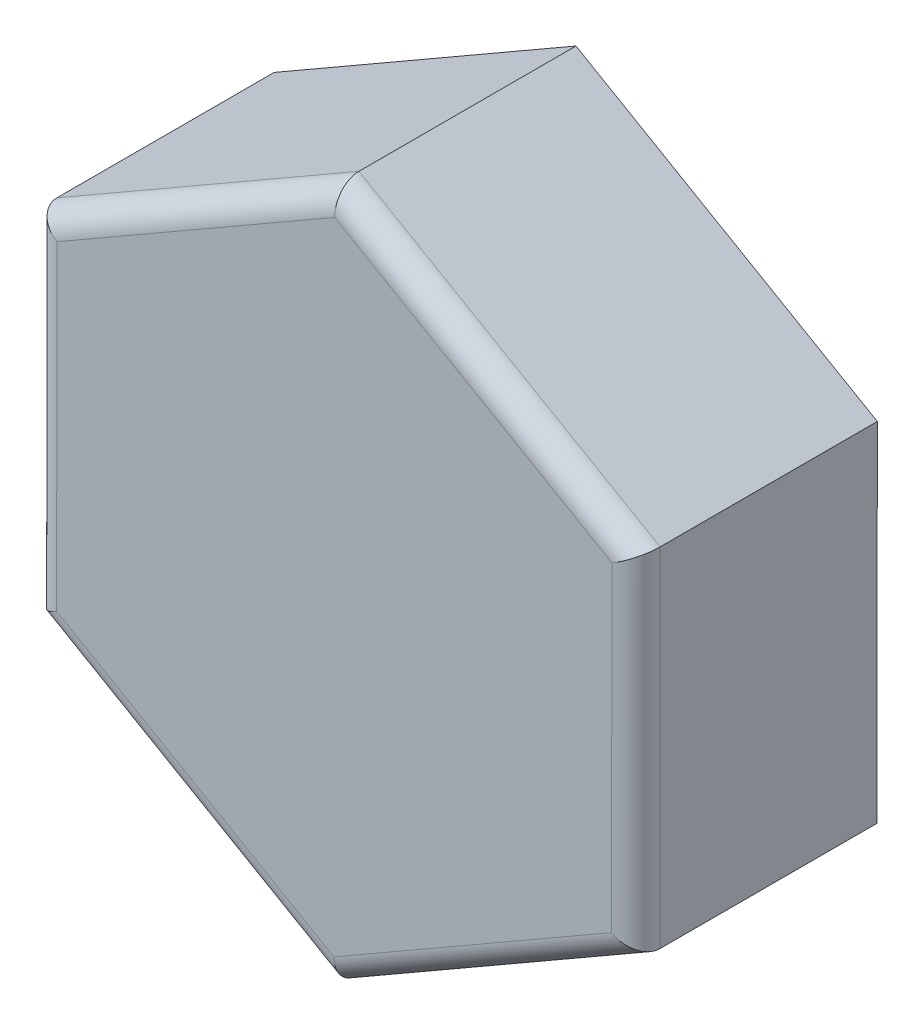
ISO-10303-21;
HEADER;
FILE_DESCRIPTION(('STEP AP214'),'2;1');
FILE_NAME('part.step','',(''),(''),'','','');
FILE_SCHEMA(('AUTOMOTIVE_DESIGN { 1 0 10303 214 1 1 1 1 }'));
ENDSEC;
DATA;
#1=APPLICATION_CONTEXT('core data for automotive mechanical design processes');
#2=APPLICATION_PROTOCOL_DEFINITION('international standard','automotive_design',2000,#1);
#3=PRODUCT_CONTEXT('',#1,'mechanical');
#4=PRODUCT('Part','Part','',(#3));
#5=PRODUCT_RELATED_PRODUCT_CATEGORY('part','',(#4));
#6=PRODUCT_DEFINITION_FORMATION('','',#4);
#7=PRODUCT_DEFINITION_CONTEXT('part definition',#1,'design');
#8=PRODUCT_DEFINITION('design','',#6,#7);
#9=PRODUCT_DEFINITION_SHAPE('','',#8);
#10=(LENGTH_UNIT() NAMED_UNIT(*) SI_UNIT(.MILLI.,.METRE.));
#11=(NAMED_UNIT(*) PLANE_ANGLE_UNIT() SI_UNIT($,.RADIAN.));
#12=(NAMED_UNIT(*) SI_UNIT($,.STERADIAN.) SOLID_ANGLE_UNIT());
#13=UNCERTAINTY_MEASURE_WITH_UNIT(LENGTH_MEASURE(1.E-05),#10,'distance_accuracy_value','');
#14=(GEOMETRIC_REPRESENTATION_CONTEXT(3) GLOBAL_UNCERTAINTY_ASSIGNED_CONTEXT((#13)) GLOBAL_UNIT_ASSIGNED_CONTEXT((#10,
#11,#12)) REPRESENTATION_CONTEXT('',''));
#15=CARTESIAN_POINT('',(0.,0.,0.));
#16=DIRECTION('',(0.,0.,1.));
#17=DIRECTION('',(1.,0.,0.));
#18=AXIS2_PLACEMENT_3D('',#15,#16,#17);
#19=CARTESIAN_POINT('',(-3.17206294168464,-1.3304316712943,1.));
#20=DIRECTION('',(-0.498963013058614,0.866623281247088,0.));
#21=DIRECTION('',(-0.866623281247088,-0.498963013058614,0.));
#22=AXIS2_PLACEMENT_3D('',#19,#20,#21);
#23=PLANE('',#22);
#24=DIRECTION('',(0.,0.,-1.));
#25=VECTOR('',#24,1.);
#26=CARTESIAN_POINT('',(-1.92119997989963,-0.610240596531655,1.));
#27=LINE('',#26,#25);
#28=CARTESIAN_POINT('',(-1.92119997989963,-0.610240596531655,0.9));
#29=VERTEX_POINT('',#28);
#30=CARTESIAN_POINT('',(-1.92119997989963,-0.610240596531655,0.));
#31=VERTEX_POINT('',#30);
#32=EDGE_CURVE('E107',#29,#31,#27,.T.);
#33=ORIENTED_EDGE('',*,*,#32,.F.);
#34=DIRECTION('',(0.866623281247088,0.498963013058614,0.));
#35=VECTOR('',#34,1.);
#36=CARTESIAN_POINT('',(-3.17206294168464,-1.3304316712943,0.9));
#37=LINE('',#36,#35);
#38=CARTESIAN_POINT('',(-3.17206294168464,-1.3304316712943,0.9));
#39=VERTEX_POINT('',#38);
#40=EDGE_CURVE('E11',#29,#39,#37,.F.);
#41=ORIENTED_EDGE('',*,*,#40,.T.);
#42=DIRECTION('',(0.,0.,-1.));
#43=VECTOR('',#42,1.);
#44=CARTESIAN_POINT('',(-3.17206294168464,-1.3304316712943,1.));
#45=LINE('',#44,#43);
#46=CARTESIAN_POINT('',(-3.17206294168464,-1.3304316712943,0.));
#47=VERTEX_POINT('',#46);
#48=EDGE_CURVE('E128',#39,#47,#45,.T.);
#49=ORIENTED_EDGE('',*,*,#48,.T.);
#50=DIRECTION('',(0.866623281247088,0.498963013058614,0.));
#51=VECTOR('',#50,1.);
#52=CARTESIAN_POINT('',(-3.17206294168464,-1.3304316712943,0.));
#53=LINE('',#52,#51);
#54=EDGE_CURVE('E122',#47,#31,#53,.T.);
#55=ORIENTED_EDGE('',*,*,#54,.T.);
#56=EDGE_LOOP('',(#33,#41,#49,#55));
#57=FACE_BOUND('',#56,.T.);
#58=ADVANCED_FACE('F37',(#57),#23,.F.);
#59=CARTESIAN_POINT('',(-1.92119997989963,-0.610240596531655,1.));
#60=DIRECTION('',(-0.999999283600312,0.00119699576595825,0.));
#61=DIRECTION('',(-0.00119699576595825,-0.999999283600312,0.));
#62=AXIS2_PLACEMENT_3D('',#59,#60,#61);
#63=PLANE('',#62);
#64=DIRECTION('',(0.,0.,-1.));
#65=VECTOR('',#64,1.);
#66=CARTESIAN_POINT('',(-1.9194722653304,0.833134042408527,1.));
#67=LINE('',#66,#65);
#68=CARTESIAN_POINT('',(-1.9194722653304,0.833134042408527,0.9));
#69=VERTEX_POINT('',#68);
#70=CARTESIAN_POINT('',(-1.9194722653304,0.833134042408527,0.));
#71=VERTEX_POINT('',#70);
#72=EDGE_CURVE('E116',#69,#71,#67,.T.);
#73=ORIENTED_EDGE('',*,*,#72,.F.);
#74=DIRECTION('',(0.00119699576595825,0.999999283600312,0.));
#75=VECTOR('',#74,1.);
#76=CARTESIAN_POINT('',(-1.92119997989963,-0.610240596531655,0.9));
#77=LINE('',#76,#75);
#78=EDGE_CURVE('E46',#69,#29,#77,.F.);
#79=ORIENTED_EDGE('',*,*,#78,.T.);
#80=ORIENTED_EDGE('',*,*,#32,.T.);
#81=DIRECTION('',(0.00119699576595825,0.999999283600312,0.));
#82=VECTOR('',#81,1.);
#83=CARTESIAN_POINT('',(-1.92119997989963,-0.610240596531655,0.));
#84=LINE('',#83,#82);
#85=EDGE_CURVE('E110',#31,#71,#84,.T.);
#86=ORIENTED_EDGE('',*,*,#85,.T.);
#87=EDGE_LOOP('',(#73,#79,#80,#86));
#88=FACE_BOUND('',#87,.T.);
#89=ADVANCED_FACE('F109',(#88),#63,.F.);
#90=CARTESIAN_POINT('',(-1.9194722653304,0.833134042408527,1.));
#91=DIRECTION('',(-0.501036270541698,-0.86542628548113,0.));
#92=DIRECTION('',(0.86542628548113,-0.501036270541698,0.));
#93=AXIS2_PLACEMENT_3D('',#90,#91,#92);
#94=PLANE('',#93);
#95=DIRECTION('',(0.,0.,-1.));
#96=VECTOR('',#95,1.);
#97=CARTESIAN_POINT('',(-3.16860751254617,1.55631760658607,1.));
#98=LINE('',#97,#96);
#99=CARTESIAN_POINT('',(-3.16860751254617,1.55631760658607,0.9));
#100=VERTEX_POINT('',#99);
#101=CARTESIAN_POINT('',(-3.16860751254617,1.55631760658607,0.));
#102=VERTEX_POINT('',#101);
#103=EDGE_CURVE('E151',#100,#102,#98,.T.);
#104=ORIENTED_EDGE('',*,*,#103,.F.);
#105=DIRECTION('',(-0.86542628548113,0.501036270541698,0.));
#106=VECTOR('',#105,1.);
#107=CARTESIAN_POINT('',(-1.9194722653304,0.833134042408527,0.9));
#108=LINE('',#107,#106);
#109=EDGE_CURVE('E61',#100,#69,#108,.F.);
#110=ORIENTED_EDGE('',*,*,#109,.T.);
#111=ORIENTED_EDGE('',*,*,#72,.T.);
#112=DIRECTION('',(-0.86542628548113,0.501036270541698,0.));
#113=VECTOR('',#112,1.);
#114=CARTESIAN_POINT('',(-1.9194722653304,0.833134042408527,0.));
#115=LINE('',#114,#113);
#116=EDGE_CURVE('E125',#71,#102,#115,.T.);
#117=ORIENTED_EDGE('',*,*,#116,.T.);
#118=EDGE_LOOP('',(#104,#110,#111,#117));
#119=FACE_BOUND('',#118,.T.);
#120=ADVANCED_FACE('F234',(#119),#94,.F.);
#121=CARTESIAN_POINT('',(-3.16860751254617,1.55631760658607,1.));
#122=DIRECTION('',(0.498963013058614,-0.866623281247088,0.));
#123=DIRECTION('',(0.866623281247088,0.498963013058614,0.));
#124=AXIS2_PLACEMENT_3D('',#121,#122,#123);
#125=PLANE('',#124);
#126=DIRECTION('',(0.,0.,-1.));
#127=VECTOR('',#126,1.);
#128=CARTESIAN_POINT('',(-4.41947047433117,0.836126531823423,1.));
#129=LINE('',#128,#127);
#130=CARTESIAN_POINT('',(-4.41947047433117,0.836126531823423,0.9));
#131=VERTEX_POINT('',#130);
#132=CARTESIAN_POINT('',(-4.41947047433117,0.836126531823423,0.));
#133=VERTEX_POINT('',#132);
#134=EDGE_CURVE('E149',#131,#133,#129,.T.);
#135=ORIENTED_EDGE('',*,*,#134,.F.);
#136=DIRECTION('',(-0.866623281247088,-0.498963013058614,0.));
#137=VECTOR('',#136,1.);
#138=CARTESIAN_POINT('',(-3.16860751254617,1.55631760658607,0.9));
#139=LINE('',#138,#137);
#140=EDGE_CURVE('E171',#131,#100,#139,.F.);
#141=ORIENTED_EDGE('',*,*,#140,.T.);
#142=ORIENTED_EDGE('',*,*,#103,.T.);
#143=DIRECTION('',(-0.866623281247088,-0.498963013058614,0.));
#144=VECTOR('',#143,1.);
#145=CARTESIAN_POINT('',(-3.16860751254617,1.55631760658607,0.));
#146=LINE('',#145,#144);
#147=EDGE_CURVE('E138',#102,#133,#146,.T.);
#148=ORIENTED_EDGE('',*,*,#147,.T.);
#149=EDGE_LOOP('',(#135,#141,#142,#148));
#150=FACE_BOUND('',#149,.T.);
#151=ADVANCED_FACE('F219',(#150),#125,.F.);
#152=CARTESIAN_POINT('',(-4.41947047433117,0.836126531823423,1.));
#153=DIRECTION('',(0.999999283600312,-0.00119699576595885,0.));
#154=DIRECTION('',(0.00119699576595885,0.999999283600312,0.));
#155=AXIS2_PLACEMENT_3D('',#152,#153,#154);
#156=PLANE('',#155);
#157=DIRECTION('',(0.,0.,-1.));
#158=VECTOR('',#157,1.);
#159=CARTESIAN_POINT('',(-4.42119818890041,-0.607248107116759,1.));
#160=LINE('',#159,#158);
#161=CARTESIAN_POINT('',(-4.42119818890041,-0.607248107116759,0.9));
#162=VERTEX_POINT('',#161);
#163=CARTESIAN_POINT('',(-4.42119818890041,-0.607248107116759,0.));
#164=VERTEX_POINT('',#163);
#165=EDGE_CURVE('E147',#162,#164,#160,.T.);
#166=ORIENTED_EDGE('',*,*,#165,.F.);
#167=DIRECTION('',(-0.00119699576595885,-0.999999283600312,0.));
#168=VECTOR('',#167,1.);
#169=CARTESIAN_POINT('',(-4.41947047433117,0.836126531823423,0.9));
#170=LINE('',#169,#168);
#171=EDGE_CURVE('E169',#162,#131,#170,.F.);
#172=ORIENTED_EDGE('',*,*,#171,.T.);
#173=ORIENTED_EDGE('',*,*,#134,.T.);
#174=DIRECTION('',(-0.00119699576595885,-0.999999283600312,0.));
#175=VECTOR('',#174,1.);
#176=CARTESIAN_POINT('',(-4.41947047433117,0.836126531823423,0.));
#177=LINE('',#176,#175);
#178=EDGE_CURVE('E141',#133,#164,#177,.T.);
#179=ORIENTED_EDGE('',*,*,#178,.T.);
#180=EDGE_LOOP('',(#166,#172,#173,#179));
#181=FACE_BOUND('',#180,.T.);
#182=ADVANCED_FACE('F216',(#181),#156,.F.);
#183=CARTESIAN_POINT('',(-4.42119818890041,-0.607248107116759,1.));
#184=DIRECTION('',(0.501036270541698,0.86542628548113,0.));
#185=DIRECTION('',(-0.86542628548113,0.501036270541698,0.));
#186=AXIS2_PLACEMENT_3D('',#183,#184,#185);
#187=PLANE('',#186);
#188=ORIENTED_EDGE('',*,*,#48,.F.);
#189=DIRECTION('',(0.86542628548113,-0.501036270541698,0.));
#190=VECTOR('',#189,1.);
#191=CARTESIAN_POINT('',(-4.42119818890041,-0.607248107116759,0.9));
#192=LINE('',#191,#190);
#193=EDGE_CURVE('E166',#39,#162,#192,.F.);
#194=ORIENTED_EDGE('',*,*,#193,.T.);
#195=ORIENTED_EDGE('',*,*,#165,.T.);
#196=DIRECTION('',(0.86542628548113,-0.501036270541698,0.));
#197=VECTOR('',#196,1.);
#198=CARTESIAN_POINT('',(-4.42119818890041,-0.607248107116759,0.));
#199=LINE('',#198,#197);
#200=EDGE_CURVE('E144',#164,#47,#199,.T.);
#201=ORIENTED_EDGE('',*,*,#200,.T.);
#202=EDGE_LOOP('',(#188,#194,#195,#201));
#203=FACE_BOUND('',#202,.T.);
#204=ADVANCED_FACE('F205',(#203),#187,.F.);
#205=CARTESIAN_POINT('',(0.,0.,1.));
#206=DIRECTION('',(0.,0.,1.));
#207=DIRECTION('',(1.,0.,0.));
#208=AXIS2_PLACEMENT_3D('',#205,#206,#207);
#209=PLANE('',#208);
#210=DIRECTION('',(-0.00119699576595885,-0.999999283600312,0.));
#211=VECTOR('',#210,1.);
#212=CARTESIAN_POINT('',(-4.32119826054038,-0.607367806693355,1.));
#213=LINE('',#212,#211);
#214=CARTESIAN_POINT('',(-4.31953965455391,0.77827184668922,1.));
#215=VERTEX_POINT('',#214);
#216=CARTESIAN_POINT('',(-4.32112915195761,-0.549632821135748,1.));
#217=VERTEX_POINT('',#216);
#218=EDGE_CURVE('E161',#215,#217,#213,.T.);
#219=ORIENTED_EDGE('',*,*,#218,.T.);
#220=DIRECTION('',(0.86542628548113,-0.501036270541698,0.));
#221=VECTOR('',#220,1.);
#222=CARTESIAN_POINT('',(-3.12195931463047,-1.24388904274618,1.));
#223=LINE('',#222,#221);
#224=CARTESIAN_POINT('',(-3.1719247245191,-1.21496170017908,1.));
#225=VERTEX_POINT('',#224);
#226=EDGE_CURVE('E163',#217,#225,#223,.T.);
#227=ORIENTED_EDGE('',*,*,#226,.T.);
#228=DIRECTION('',(0.866623281247088,0.498963013058614,0.));
#229=VECTOR('',#228,1.);
#230=CARTESIAN_POINT('',(-1.9710962812055,-0.523578268406946,1.));
#231=LINE('',#230,#229);
#232=CARTESIAN_POINT('',(-2.02113079967689,-0.552385911397451,1.));
#233=VERTEX_POINT('',#232);
#234=EDGE_CURVE('E115',#225,#233,#231,.T.);
#235=ORIENTED_EDGE('',*,*,#234,.T.);
#236=DIRECTION('',(0.00119699576595825,0.999999283600312,0.));
#237=VECTOR('',#236,1.);
#238=CARTESIAN_POINT('',(-2.01947219369043,0.833253741985123,1.));
#239=LINE('',#238,#237);
#240=CARTESIAN_POINT('',(-2.0195413022732,0.775518756427516,1.));
#241=VERTEX_POINT('',#240);
#242=EDGE_CURVE('E155',#233,#241,#239,.T.);
#243=ORIENTED_EDGE('',*,*,#242,.T.);
#244=DIRECTION('',(-0.86542628548113,0.501036270541698,0.));
#245=VECTOR('',#244,1.);
#246=CARTESIAN_POINT('',(-3.21871113960034,1.46977497803795,1.));
#247=LINE('',#246,#245);
#248=CARTESIAN_POINT('',(-3.16874572971171,1.44084763547085,1.));
#249=VERTEX_POINT('',#248);
#250=EDGE_CURVE('E157',#241,#249,#247,.T.);
#251=ORIENTED_EDGE('',*,*,#250,.T.);
#252=DIRECTION('',(-0.866623281247088,-0.498963013058614,0.));
#253=VECTOR('',#252,1.);
#254=CARTESIAN_POINT('',(-4.36957417302531,0.749464203698714,1.));
#255=LINE('',#254,#253);
#256=EDGE_CURVE('E159',#249,#215,#255,.T.);
#257=ORIENTED_EDGE('',*,*,#256,.T.);
#258=EDGE_LOOP('',(#219,#227,#235,#243,#251,#257));
#259=FACE_BOUND('',#258,.T.);
#260=ADVANCED_FACE('F195',(#259),#209,.T.);
#261=CARTESIAN_POINT('',(0.,0.,0.));
#262=DIRECTION('',(0.,0.,1.));
#263=DIRECTION('',(1.,0.,0.));
#264=AXIS2_PLACEMENT_3D('',#261,#262,#263);
#265=PLANE('',#264);
#266=CARTESIAN_POINT('',(-3.1703352271154,0.112942967645885,0.));
#267=DIRECTION('',(0.,0.,-1.));
#268=DIRECTION('',(-1.,0.,0.));
#269=AXIS2_PLACEMENT_3D('',#266,#267,#268);
#270=CIRCLE('',#269,0.800000000000001);
#271=CARTESIAN_POINT('',(-3.97033522711541,0.112942967645885,0.));
#272=VERTEX_POINT('',#271);
#273=EDGE_CURVE('E134',#272,#272,#270,.T.);
#274=ORIENTED_EDGE('',*,*,#273,.F.);
#275=EDGE_LOOP('',(#274));
#276=FACE_BOUND('',#275,.T.);
#277=ORIENTED_EDGE('',*,*,#54,.F.);
#278=ORIENTED_EDGE('',*,*,#200,.F.);
#279=ORIENTED_EDGE('',*,*,#178,.F.);
#280=ORIENTED_EDGE('',*,*,#147,.F.);
#281=ORIENTED_EDGE('',*,*,#116,.F.);
#282=ORIENTED_EDGE('',*,*,#85,.F.);
#283=EDGE_LOOP('',(#277,#278,#279,#280,#281,#282));
#284=FACE_BOUND('',#283,.T.);
#285=ADVANCED_FACE('F120',(#276,#284),#265,.F.);
#286=CARTESIAN_POINT('',(-0.170707629630085,-0.294858632997425,0.9));
#287=DIRECTION('',(0.86542628548113,-0.501036270541698,0.));
#288=DIRECTION('',(0.501036270541698,0.86542628548113,0.));
#289=AXIS2_PLACEMENT_3D('',#286,#287,#288);
#290=CYLINDRICAL_SURFACE('',#289,0.1);
#291=CARTESIAN_POINT('',(-2.0195413022732,0.775518756427516,0.9));
#292=DIRECTION('',(0.498963013058614,-0.866623281247088,0.));
#293=DIRECTION('',(-0.866623281247088,-0.498963013058614,0.));
#294=AXIS2_PLACEMENT_3D('',#291,#292,#293);
#295=ELLIPSE('',#294,0.115470053837925,0.1);
#296=EDGE_CURVE('E132',#69,#241,#295,.T.);
#297=ORIENTED_EDGE('',*,*,#296,.F.);
#298=ORIENTED_EDGE('',*,*,#109,.F.);
#299=CARTESIAN_POINT('',(-3.16874572971171,1.44084763547085,0.9));
#300=DIRECTION('',(0.999999283600312,-0.00119699576595806,0.));
#301=DIRECTION('',(-0.001196995765958,-0.999999283600312,0.));
#302=AXIS2_PLACEMENT_3D('',#299,#300,#301);
#303=ELLIPSE('',#302,0.115470053837925,0.1);
#304=EDGE_CURVE('E41',#249,#100,#303,.F.);
#305=ORIENTED_EDGE('',*,*,#304,.F.);
#306=ORIENTED_EDGE('',*,*,#250,.F.);
#307=EDGE_LOOP('',(#297,#298,#305,#306));
#308=FACE_BOUND('',#307,.T.);
#309=ADVANCED_FACE('F39',(#308),#290,.T.);
#310=CARTESIAN_POINT('',(-1.41194508811757,2.45233504925427,0.9));
#311=DIRECTION('',(0.866623281247088,0.498963013058614,0.));
#312=DIRECTION('',(-0.498963013058614,0.866623281247088,0.));
#313=AXIS2_PLACEMENT_3D('',#310,#311,#312);
#314=CYLINDRICAL_SURFACE('',#313,0.1);
#315=ORIENTED_EDGE('',*,*,#304,.T.);
#316=ORIENTED_EDGE('',*,*,#140,.F.);
#317=CARTESIAN_POINT('',(-4.31953965455391,0.77827184668922,0.9));
#318=DIRECTION('',(0.501036270541698,0.86542628548113,0.));
#319=DIRECTION('',(0.86542628548113,-0.501036270541698,0.));
#320=AXIS2_PLACEMENT_3D('',#317,#318,#319);
#321=ELLIPSE('',#320,0.115470053837925,0.1);
#322=EDGE_CURVE('E183',#215,#131,#321,.F.);
#323=ORIENTED_EDGE('',*,*,#322,.F.);
#324=ORIENTED_EDGE('',*,*,#256,.F.);
#325=EDGE_LOOP('',(#315,#316,#323,#324));
#326=FACE_BOUND('',#325,.T.);
#327=ADVANCED_FACE('F222',(#326),#314,.T.);
#328=CARTESIAN_POINT('',(-2.02046670067955,0.00241849181857984,0.9));
#329=DIRECTION('',(-0.00119699576595825,-0.999999283600312,0.));
#330=DIRECTION('',(0.999999283600312,-0.00119699576595825,0.));
#331=AXIS2_PLACEMENT_3D('',#328,#329,#330);
#332=CYLINDRICAL_SURFACE('',#331,0.1);
#333=ORIENTED_EDGE('',*,*,#296,.T.);
#334=ORIENTED_EDGE('',*,*,#242,.F.);
#335=CARTESIAN_POINT('',(-2.0211307996769,-0.552385911397451,0.9));
#336=DIRECTION('',(-0.501036270541698,-0.86542628548113,0.));
#337=DIRECTION('',(-0.86542628548113,0.501036270541698,0.));
#338=AXIS2_PLACEMENT_3D('',#335,#336,#337);
#339=ELLIPSE('',#338,0.115470053837925,0.1);
#340=EDGE_CURVE('E180',#29,#233,#339,.T.);
#341=ORIENTED_EDGE('',*,*,#340,.F.);
#342=ORIENTED_EDGE('',*,*,#78,.F.);
#343=EDGE_LOOP('',(#333,#334,#341,#342));
#344=FACE_BOUND('',#343,.T.);
#345=ADVANCED_FACE('F189',(#344),#332,.T.);
#346=CARTESIAN_POINT('',(-4.32046505296027,0.00517158208028641,0.9));
#347=DIRECTION('',(0.00119699576595885,0.999999283600312,0.));
#348=DIRECTION('',(-0.999999283600312,0.00119699576595885,0.));
#349=AXIS2_PLACEMENT_3D('',#346,#347,#348);
#350=CYLINDRICAL_SURFACE('',#349,0.1);
#351=ORIENTED_EDGE('',*,*,#322,.T.);
#352=ORIENTED_EDGE('',*,*,#171,.F.);
#353=CARTESIAN_POINT('',(-4.32112915195761,-0.549632821135747,0.9));
#354=DIRECTION('',(-0.498963013058613,0.866623281247088,0.));
#355=DIRECTION('',(0.866623281247089,0.498963013058613,0.));
#356=AXIS2_PLACEMENT_3D('',#353,#354,#355);
#357=ELLIPSE('',#356,0.115470053837925,0.1);
#358=EDGE_CURVE('E177',#217,#162,#357,.F.);
#359=ORIENTED_EDGE('',*,*,#358,.F.);
#360=ORIENTED_EDGE('',*,*,#218,.F.);
#361=EDGE_LOOP('',(#351,#352,#359,#360));
#362=FACE_BOUND('',#361,.T.);
#363=ADVANCED_FACE('F213',(#362),#350,.T.);
#364=CARTESIAN_POINT('',(-0.264330158082755,0.459101502385968,0.9));
#365=DIRECTION('',(-0.866623281247088,-0.498963013058614,0.));
#366=DIRECTION('',(0.498963013058614,-0.866623281247088,0.));
#367=AXIS2_PLACEMENT_3D('',#364,#365,#366);
#368=CYLINDRICAL_SURFACE('',#367,0.1);
#369=ORIENTED_EDGE('',*,*,#340,.T.);
#370=ORIENTED_EDGE('',*,*,#234,.F.);
#371=CARTESIAN_POINT('',(-3.1719247245191,-1.21496170017908,0.9));
#372=DIRECTION('',(-0.999999283600312,0.00119699576595802,0.));
#373=DIRECTION('',(-0.00119699576595789,-0.999999283600312,0.));
#374=AXIS2_PLACEMENT_3D('',#371,#372,#373);
#375=ELLIPSE('',#374,0.115470053837925,0.1);
#376=EDGE_CURVE('E175',#39,#225,#375,.T.);
#377=ORIENTED_EDGE('',*,*,#376,.F.);
#378=ORIENTED_EDGE('',*,*,#40,.F.);
#379=EDGE_LOOP('',(#369,#370,#377,#378));
#380=FACE_BOUND('',#379,.T.);
#381=ADVANCED_FACE('F201',(#380),#368,.T.);
#382=CARTESIAN_POINT('',(-1.32309105187599,-2.28533908960402,0.9));
#383=DIRECTION('',(-0.86542628548113,0.501036270541698,0.));
#384=DIRECTION('',(-0.501036270541698,-0.86542628548113,0.));
#385=AXIS2_PLACEMENT_3D('',#382,#383,#384);
#386=CYLINDRICAL_SURFACE('',#385,0.1);
#387=ORIENTED_EDGE('',*,*,#358,.T.);
#388=ORIENTED_EDGE('',*,*,#193,.F.);
#389=ORIENTED_EDGE('',*,*,#376,.T.);
#390=ORIENTED_EDGE('',*,*,#226,.F.);
#391=EDGE_LOOP('',(#387,#388,#389,#390));
#392=FACE_BOUND('',#391,.T.);
#393=ADVANCED_FACE('F208',(#392),#386,.T.);
#394=CARTESIAN_POINT('',(-3.1703352271154,0.112942967645885,0.01));
#395=DIRECTION('',(0.,0.,-1.));
#396=DIRECTION('',(-1.,0.,0.));
#397=AXIS2_PLACEMENT_3D('',#394,#395,#396);
#398=CYLINDRICAL_SURFACE('',#397,0.800000000000001);
#399=CARTESIAN_POINT('',(-3.1703352271154,0.112942967645885,0.01));
#400=DIRECTION('',(0.,0.,-1.));
#401=DIRECTION('',(-1.,0.,0.));
#402=AXIS2_PLACEMENT_3D('',#399,#400,#401);
#403=CIRCLE('',#402,0.800000000000001);
#404=CARTESIAN_POINT('',(-3.97033522711541,0.112942967645885,0.01));
#405=VERTEX_POINT('',#404);
#406=EDGE_CURVE('E178',#405,#405,#403,.T.);
#407=CARTESIAN_POINT('',(-3.97033522711541,0.112942967645885,0.01));
#408=CARTESIAN_POINT('',(-3.97033522711541,0.112942967645885,0.00989583333333334));
#409=CARTESIAN_POINT('',(-3.97033522711541,0.112942967645885,0.00979166666666667));
#410=CARTESIAN_POINT('',(-3.97033522711541,0.112942967645885,0.00958333333333334));
#411=CARTESIAN_POINT('',(-3.97033522711541,0.112942967645885,0.00947916666666667));
#412=CARTESIAN_POINT('',(-3.97033522711541,0.112942967645885,0.00927083333333333));
#413=CARTESIAN_POINT('',(-3.97033522711541,0.112942967645885,0.00916666666666667));
#414=CARTESIAN_POINT('',(-3.97033522711541,0.112942967645885,0.00895833333333334));
#415=CARTESIAN_POINT('',(-3.97033522711541,0.112942967645885,0.00885416666666667));
#416=CARTESIAN_POINT('',(-3.97033522711541,0.112942967645885,0.00864583333333334));
#417=CARTESIAN_POINT('',(-3.97033522711541,0.112942967645885,0.00854166666666667));
#418=CARTESIAN_POINT('',(-3.97033522711541,0.112942967645885,0.00833333333333333));
#419=CARTESIAN_POINT('',(-3.97033522711541,0.112942967645885,0.00822916666666667));
#420=CARTESIAN_POINT('',(-3.97033522711541,0.112942967645885,0.00802083333333333));
#421=CARTESIAN_POINT('',(-3.97033522711541,0.112942967645885,0.00791666666666667));
#422=CARTESIAN_POINT('',(-3.97033522711541,0.112942967645885,0.00770833333333333));
#423=CARTESIAN_POINT('',(-3.97033522711541,0.112942967645885,0.00760416666666667));
#424=CARTESIAN_POINT('',(-3.97033522711541,0.112942967645885,0.00739583333333333));
#425=CARTESIAN_POINT('',(-3.97033522711541,0.112942967645885,0.00729166666666667));
#426=CARTESIAN_POINT('',(-3.97033522711541,0.112942967645885,0.00708333333333333));
#427=CARTESIAN_POINT('',(-3.97033522711541,0.112942967645885,0.00697916666666667));
#428=CARTESIAN_POINT('',(-3.97033522711541,0.112942967645885,0.00677083333333333));
#429=CARTESIAN_POINT('',(-3.97033522711541,0.112942967645885,0.00666666666666667));
#430=CARTESIAN_POINT('',(-3.97033522711541,0.112942967645885,0.00645833333333333));
#431=CARTESIAN_POINT('',(-3.97033522711541,0.112942967645885,0.00635416666666667));
#432=CARTESIAN_POINT('',(-3.97033522711541,0.112942967645885,0.00614583333333333));
#433=CARTESIAN_POINT('',(-3.97033522711541,0.112942967645885,0.00604166666666667));
#434=CARTESIAN_POINT('',(-3.97033522711541,0.112942967645885,0.00583333333333333));
#435=CARTESIAN_POINT('',(-3.97033522711541,0.112942967645885,0.00572916666666667));
#436=CARTESIAN_POINT('',(-3.97033522711541,0.112942967645885,0.00552083333333333));
#437=CARTESIAN_POINT('',(-3.97033522711541,0.112942967645885,0.00541666666666667));
#438=CARTESIAN_POINT('',(-3.97033522711541,0.112942967645885,0.00520833333333333));
#439=CARTESIAN_POINT('',(-3.97033522711541,0.112942967645885,0.00510416666666667));
#440=CARTESIAN_POINT('',(-3.97033522711541,0.112942967645885,0.00489583333333333));
#441=CARTESIAN_POINT('',(-3.97033522711541,0.112942967645885,0.00479166666666667));
#442=CARTESIAN_POINT('',(-3.97033522711541,0.112942967645885,0.00458333333333333));
#443=CARTESIAN_POINT('',(-3.97033522711541,0.112942967645885,0.00447916666666667));
#444=CARTESIAN_POINT('',(-3.97033522711541,0.112942967645885,0.00427083333333333));
#445=CARTESIAN_POINT('',(-3.97033522711541,0.112942967645885,0.00416666666666667));
#446=CARTESIAN_POINT('',(-3.97033522711541,0.112942967645885,0.00395833333333333));
#447=CARTESIAN_POINT('',(-3.97033522711541,0.112942967645885,0.00385416666666667));
#448=CARTESIAN_POINT('',(-3.97033522711541,0.112942967645885,0.00364583333333333));
#449=CARTESIAN_POINT('',(-3.97033522711541,0.112942967645885,0.00354166666666667));
#450=CARTESIAN_POINT('',(-3.97033522711541,0.112942967645885,0.00333333333333333));
#451=CARTESIAN_POINT('',(-3.97033522711541,0.112942967645885,0.00322916666666667));
#452=CARTESIAN_POINT('',(-3.97033522711541,0.112942967645885,0.00302083333333333));
#453=CARTESIAN_POINT('',(-3.97033522711541,0.112942967645885,0.00291666666666667));
#454=CARTESIAN_POINT('',(-3.97033522711541,0.112942967645885,0.00270833333333333));
#455=CARTESIAN_POINT('',(-3.97033522711541,0.112942967645885,0.00260416666666667));
#456=CARTESIAN_POINT('',(-3.97033522711541,0.112942967645885,0.00239583333333333));
#457=CARTESIAN_POINT('',(-3.97033522711541,0.112942967645885,0.00229166666666667));
#458=CARTESIAN_POINT('',(-3.97033522711541,0.112942967645885,0.00208333333333333));
#459=CARTESIAN_POINT('',(-3.97033522711541,0.112942967645885,0.00197916666666667));
#460=CARTESIAN_POINT('',(-3.97033522711541,0.112942967645885,0.00177083333333333));
#461=CARTESIAN_POINT('',(-3.97033522711541,0.112942967645885,0.00166666666666667));
#462=CARTESIAN_POINT('',(-3.97033522711541,0.112942967645885,0.00145833333333333));
#463=CARTESIAN_POINT('',(-3.97033522711541,0.112942967645885,0.00135416666666667));
#464=CARTESIAN_POINT('',(-3.97033522711541,0.112942967645885,0.00114583333333333));
#465=CARTESIAN_POINT('',(-3.97033522711541,0.112942967645885,0.00104166666666667));
#466=CARTESIAN_POINT('',(-3.97033522711541,0.112942967645885,0.000833333333333334));
#467=CARTESIAN_POINT('',(-3.97033522711541,0.112942967645885,0.000729166666666667));
#468=CARTESIAN_POINT('',(-3.97033522711541,0.112942967645885,0.000520833333333334));
#469=CARTESIAN_POINT('',(-3.97033522711541,0.112942967645885,0.000416666666666667));
#470=CARTESIAN_POINT('',(-3.97033522711541,0.112942967645885,0.000208333333333334));
#471=CARTESIAN_POINT('',(-3.97033522711541,0.112942967645885,0.000104166666666667));
#472=CARTESIAN_POINT('',(-3.97033522711541,0.112942967645885,0.));
#473=B_SPLINE_CURVE_WITH_KNOTS('',3,(#407,#408,#409,#410,#411,#412,#413,#414,#415,#416,#417,
#418,#419,#420,#421,#422,#423,#424,#425,#426,#427,#428,#429,#430,#431,#432,#433,#434,#435,#436,
#437,#438,#439,#440,#441,#442,#443,#444,#445,#446,#447,#448,#449,#450,#451,#452,#453,#454,#455,
#456,#457,#458,#459,#460,#461,#462,#463,#464,#465,#466,#467,#468,#469,#470,#471,#472),
.UNSPECIFIED.,.F.,.F.,(4,2,2,2,2,2,2,2,2,2,2,2,2,2,2,2,2,2,2,2,2,2,2,2,2,2,2,2,2,2,2,2,4),(0.,
0.000312500000000001,0.000625000000000002,0.000937500000000001,0.00125,0.0015625,0.001875,
0.0021875,0.0025,0.0028125,0.003125,0.0034375,0.00375,0.0040625,0.004375,0.0046875,0.005,
0.0053125,0.005625,0.0059375,0.00625,0.0065625,0.006875,0.0071875,0.0075,0.0078125,0.008125,
0.0084375,0.00875,0.0090625,0.009375,0.0096875,0.01),.UNSPECIFIED.);
#474=EDGE_CURVE('BSEAM240',#405,#272,#473,.T.);
#475=ORIENTED_EDGE('',*,*,#406,.F.);
#476=ORIENTED_EDGE('',*,*,#273,.T.);
#477=ORIENTED_EDGE('',*,*,#474,.T.);
#478=ORIENTED_EDGE('',*,*,#474,.F.);
#479=EDGE_LOOP('',(#475,#477,#476,#478));
#480=FACE_BOUND('',#479,.T.);
#481=ADVANCED_FACE('F240',(#480),#398,.F.);
#482=CARTESIAN_POINT('',(-3.1703352271154,0.112942967645885,0.01));
#483=DIRECTION('',(0.,0.,-1.));
#484=DIRECTION('',(-1.,0.,0.));
#485=AXIS2_PLACEMENT_3D('',#482,#483,#484);
#486=PLANE('',#485);
#487=ORIENTED_EDGE('',*,*,#406,.T.);
#488=EDGE_LOOP('',(#487));
#489=FACE_BOUND('',#488,.T.);
#490=ADVANCED_FACE('F263',(#489),#486,.T.);
#491=CLOSED_SHELL('',(#58,#89,#120,#151,#182,#204,#260,#285,#309,#327,#345,#363,#381,#393,#481,#490));
#492=MANIFOLD_SOLID_BREP('B2',#491);
#493=ADVANCED_BREP_SHAPE_REPRESENTATION('',(#18,#492),#14);
#494=SHAPE_DEFINITION_REPRESENTATION(#9,#493);
ENDSEC;
END-ISO-10303-21;
